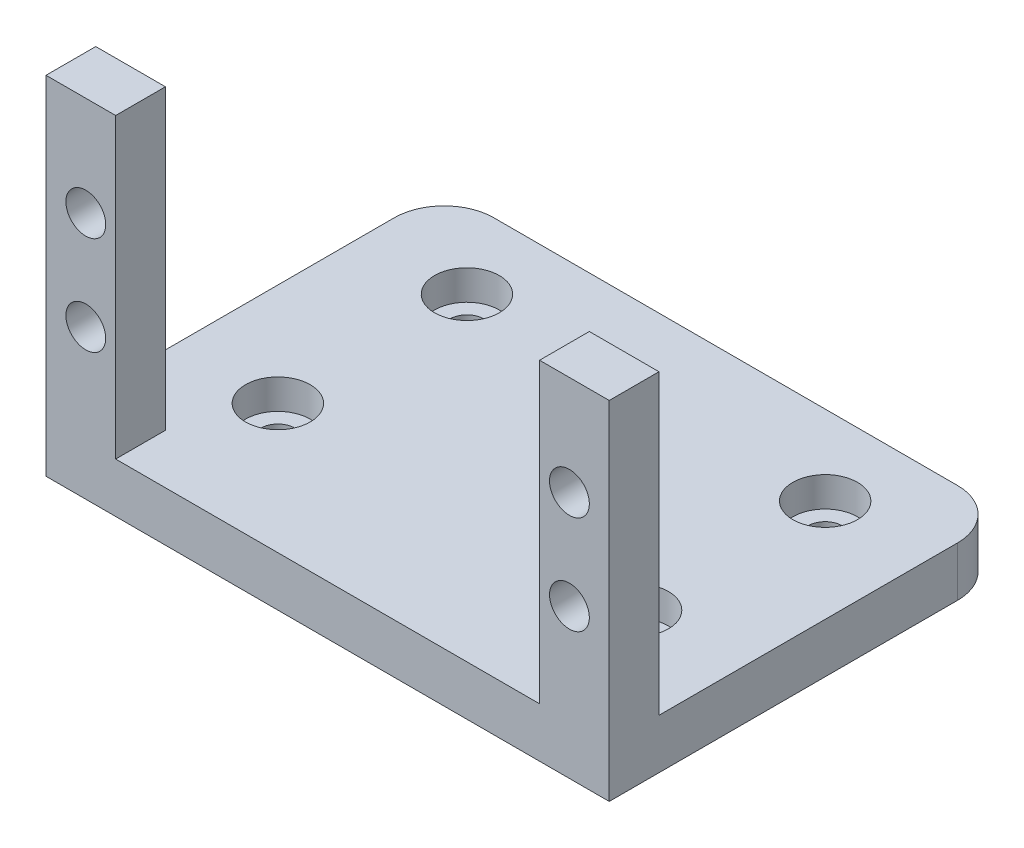
ISO-10303-21;
HEADER;
FILE_DESCRIPTION(('STEP AP214'),'2;1');
FILE_NAME('part.step','',(''),(''),'','','');
FILE_SCHEMA(('AUTOMOTIVE_DESIGN { 1 0 10303 214 1 1 1 1 }'));
ENDSEC;
DATA;
#1=APPLICATION_CONTEXT('core data for automotive mechanical design processes');
#2=APPLICATION_PROTOCOL_DEFINITION('international standard','automotive_design',2000,#1);
#3=PRODUCT_CONTEXT('',#1,'mechanical');
#4=PRODUCT('Part','Part','',(#3));
#5=PRODUCT_RELATED_PRODUCT_CATEGORY('part','',(#4));
#6=PRODUCT_DEFINITION_FORMATION('','',#4);
#7=PRODUCT_DEFINITION_CONTEXT('part definition',#1,'design');
#8=PRODUCT_DEFINITION('design','',#6,#7);
#9=PRODUCT_DEFINITION_SHAPE('','',#8);
#10=(LENGTH_UNIT() NAMED_UNIT(*) SI_UNIT(.MILLI.,.METRE.));
#11=(NAMED_UNIT(*) PLANE_ANGLE_UNIT() SI_UNIT($,.RADIAN.));
#12=(NAMED_UNIT(*) SI_UNIT($,.STERADIAN.) SOLID_ANGLE_UNIT());
#13=UNCERTAINTY_MEASURE_WITH_UNIT(LENGTH_MEASURE(1.E-05),#10,'distance_accuracy_value','');
#14=(GEOMETRIC_REPRESENTATION_CONTEXT(3) GLOBAL_UNCERTAINTY_ASSIGNED_CONTEXT((#13)) GLOBAL_UNIT_ASSIGNED_CONTEXT((#10,
#11,#12)) REPRESENTATION_CONTEXT('',''));
#15=CARTESIAN_POINT('',(0.,0.,0.));
#16=DIRECTION('',(0.,0.,1.));
#17=DIRECTION('',(1.,0.,0.));
#18=AXIS2_PLACEMENT_3D('',#15,#16,#17);
#19=CARTESIAN_POINT('',(0.,-5.,0.));
#20=DIRECTION('',(0.,-1.,0.));
#21=DIRECTION('',(0.,0.,-1.));
#22=AXIS2_PLACEMENT_3D('',#19,#20,#21);
#23=PLANE('',#22);
#24=CARTESIAN_POINT('',(-18.,-5.,-32.));
#25=DIRECTION('',(0.,-1.,0.));
#26=DIRECTION('',(0.,0.,-1.));
#27=AXIS2_PLACEMENT_3D('',#24,#25,#26);
#28=CIRCLE('',#27,1.7);
#29=CARTESIAN_POINT('',(-18.,-5.,-33.7));
#30=VERTEX_POINT('',#29);
#31=EDGE_CURVE('E320',#30,#30,#28,.F.);
#32=ORIENTED_EDGE('',*,*,#31,.T.);
#33=EDGE_LOOP('',(#32));
#34=FACE_BOUND('',#33,.T.);
#35=CARTESIAN_POINT('',(18.,-5.,-13.));
#36=DIRECTION('',(0.,-1.,0.));
#37=DIRECTION('',(0.,0.,-1.));
#38=AXIS2_PLACEMENT_3D('',#35,#36,#37);
#39=CIRCLE('',#38,1.7);
#40=CARTESIAN_POINT('',(18.,-5.,-14.7));
#41=VERTEX_POINT('',#40);
#42=EDGE_CURVE('E308',#41,#41,#39,.F.);
#43=ORIENTED_EDGE('',*,*,#42,.T.);
#44=EDGE_LOOP('',(#43));
#45=FACE_BOUND('',#44,.T.);
#46=CARTESIAN_POINT('',(-18.,-5.,-13.));
#47=DIRECTION('',(0.,-1.,0.));
#48=DIRECTION('',(0.,0.,-1.));
#49=AXIS2_PLACEMENT_3D('',#46,#47,#48);
#50=CIRCLE('',#49,1.7);
#51=CARTESIAN_POINT('',(-18.,-5.,-14.7));
#52=VERTEX_POINT('',#51);
#53=EDGE_CURVE('E296',#52,#52,#50,.F.);
#54=ORIENTED_EDGE('',*,*,#53,.T.);
#55=EDGE_LOOP('',(#54));
#56=FACE_BOUND('',#55,.T.);
#57=DIRECTION('',(-1.,0.,0.));
#58=VECTOR('',#57,1.);
#59=CARTESIAN_POINT('',(-28.3,-5.,-40.));
#60=LINE('',#59,#58);
#61=CARTESIAN_POINT('',(23.3,-5.,-40.));
#62=VERTEX_POINT('',#61);
#63=CARTESIAN_POINT('',(-23.3,-5.,-40.));
#64=VERTEX_POINT('',#63);
#65=EDGE_CURVE('E229',#62,#64,#60,.T.);
#66=ORIENTED_EDGE('',*,*,#65,.F.);
#67=CARTESIAN_POINT('',(23.3,-5.,-35.));
#68=DIRECTION('',(0.,-1.,0.));
#69=DIRECTION('',(0.,0.,-1.));
#70=AXIS2_PLACEMENT_3D('',#67,#68,#69);
#71=CIRCLE('',#70,5.);
#72=CARTESIAN_POINT('',(28.3,-5.,-35.));
#73=VERTEX_POINT('',#72);
#74=EDGE_CURVE('E47',#62,#73,#71,.T.);
#75=ORIENTED_EDGE('',*,*,#74,.T.);
#76=DIRECTION('',(0.,0.,-1.));
#77=VECTOR('',#76,1.);
#78=CARTESIAN_POINT('',(28.3,-5.,0.));
#79=LINE('',#78,#77);
#80=CARTESIAN_POINT('',(28.3,-5.,0.));
#81=VERTEX_POINT('',#80);
#82=EDGE_CURVE('E227',#81,#73,#79,.T.);
#83=ORIENTED_EDGE('',*,*,#82,.F.);
#84=DIRECTION('',(1.,0.,0.));
#85=VECTOR('',#84,1.);
#86=CARTESIAN_POINT('',(-28.3,-5.,0.));
#87=LINE('',#86,#85);
#88=CARTESIAN_POINT('',(-28.3,-5.,0.));
#89=VERTEX_POINT('',#88);
#90=EDGE_CURVE('E138',#89,#81,#87,.T.);
#91=ORIENTED_EDGE('',*,*,#90,.F.);
#92=DIRECTION('',(0.,0.,1.));
#93=VECTOR('',#92,1.);
#94=CARTESIAN_POINT('',(-28.3,-5.,0.));
#95=LINE('',#94,#93);
#96=CARTESIAN_POINT('',(-28.3,-5.,-35.));
#97=VERTEX_POINT('',#96);
#98=EDGE_CURVE('E223',#97,#89,#95,.T.);
#99=ORIENTED_EDGE('',*,*,#98,.F.);
#100=CARTESIAN_POINT('',(-23.3,-5.,-35.));
#101=DIRECTION('',(0.,-1.,0.));
#102=DIRECTION('',(0.,0.,-1.));
#103=AXIS2_PLACEMENT_3D('',#100,#101,#102);
#104=CIRCLE('',#103,5.);
#105=EDGE_CURVE('E59',#97,#64,#104,.T.);
#106=ORIENTED_EDGE('',*,*,#105,.T.);
#107=EDGE_LOOP('',(#66,#75,#83,#91,#99,#106));
#108=FACE_BOUND('',#107,.T.);
#109=CARTESIAN_POINT('',(18.,-5.,-32.));
#110=DIRECTION('',(0.,-1.,0.));
#111=DIRECTION('',(0.,0.,-1.));
#112=AXIS2_PLACEMENT_3D('',#109,#110,#111);
#113=CIRCLE('',#112,1.7);
#114=CARTESIAN_POINT('',(18.,-5.,-33.7));
#115=VERTEX_POINT('',#114);
#116=EDGE_CURVE('E284',#115,#115,#113,.F.);
#117=ORIENTED_EDGE('',*,*,#116,.T.);
#118=EDGE_LOOP('',(#117));
#119=FACE_BOUND('',#118,.T.);
#120=ADVANCED_FACE('F39',(#34,#45,#56,#108,#119),#23,.T.);
#121=CARTESIAN_POINT('',(-28.3,-5.,0.));
#122=DIRECTION('',(-1.,0.,0.));
#123=DIRECTION('',(0.,0.,1.));
#124=AXIS2_PLACEMENT_3D('',#121,#122,#123);
#125=PLANE('',#124);
#126=DIRECTION('',(0.,0.,1.));
#127=VECTOR('',#126,1.);
#128=CARTESIAN_POINT('',(-28.3,0.,0.));
#129=LINE('',#128,#127);
#130=CARTESIAN_POINT('',(-28.3,0.,-35.));
#131=VERTEX_POINT('',#130);
#132=CARTESIAN_POINT('',(-28.3,0.,-5.));
#133=VERTEX_POINT('',#132);
#134=EDGE_CURVE('E217',#131,#133,#129,.T.);
#135=ORIENTED_EDGE('',*,*,#134,.F.);
#136=DIRECTION('',(0.,1.,0.));
#137=VECTOR('',#136,1.);
#138=CARTESIAN_POINT('',(-28.3,-5.,-35.));
#139=LINE('',#138,#137);
#140=EDGE_CURVE('E11',#131,#97,#139,.F.);
#141=ORIENTED_EDGE('',*,*,#140,.T.);
#142=ORIENTED_EDGE('',*,*,#98,.T.);
#143=DIRECTION('',(0.,1.,0.));
#144=VECTOR('',#143,1.);
#145=CARTESIAN_POINT('',(-28.3,-5.,0.));
#146=LINE('',#145,#144);
#147=CARTESIAN_POINT('',(-28.3,29.9,0.));
#148=VERTEX_POINT('',#147);
#149=EDGE_CURVE('E143',#89,#148,#146,.T.);
#150=ORIENTED_EDGE('',*,*,#149,.T.);
#151=DIRECTION('',(0.,0.,1.));
#152=VECTOR('',#151,1.);
#153=CARTESIAN_POINT('',(-28.3,29.9,-5.));
#154=LINE('',#153,#152);
#155=CARTESIAN_POINT('',(-28.3,29.9,-5.));
#156=VERTEX_POINT('',#155);
#157=EDGE_CURVE('E210',#156,#148,#154,.T.);
#158=ORIENTED_EDGE('',*,*,#157,.F.);
#159=DIRECTION('',(0.,-1.,0.));
#160=VECTOR('',#159,1.);
#161=CARTESIAN_POINT('',(-28.3,29.9,-5.));
#162=LINE('',#161,#160);
#163=EDGE_CURVE('E200',#156,#133,#162,.T.);
#164=ORIENTED_EDGE('',*,*,#163,.T.);
#165=EDGE_LOOP('',(#135,#141,#142,#150,#158,#164));
#166=FACE_BOUND('',#165,.T.);
#167=ADVANCED_FACE('F265',(#166),#125,.T.);
#168=CARTESIAN_POINT('',(-28.3,-5.,-40.));
#169=DIRECTION('',(0.,0.,-1.));
#170=DIRECTION('',(-1.,0.,0.));
#171=AXIS2_PLACEMENT_3D('',#168,#169,#170);
#172=PLANE('',#171);
#173=DIRECTION('',(-1.,0.,0.));
#174=VECTOR('',#173,1.);
#175=CARTESIAN_POINT('',(-28.3,0.,-40.));
#176=LINE('',#175,#174);
#177=CARTESIAN_POINT('',(23.3,0.,-40.));
#178=VERTEX_POINT('',#177);
#179=CARTESIAN_POINT('',(-23.3,0.,-40.));
#180=VERTEX_POINT('',#179);
#181=EDGE_CURVE('E225',#178,#180,#176,.T.);
#182=ORIENTED_EDGE('',*,*,#181,.F.);
#183=DIRECTION('',(0.,1.,0.));
#184=VECTOR('',#183,1.);
#185=CARTESIAN_POINT('',(23.3,-5.,-40.));
#186=LINE('',#185,#184);
#187=EDGE_CURVE('E249',#178,#62,#186,.F.);
#188=ORIENTED_EDGE('',*,*,#187,.T.);
#189=ORIENTED_EDGE('',*,*,#65,.T.);
#190=DIRECTION('',(0.,1.,0.));
#191=VECTOR('',#190,1.);
#192=CARTESIAN_POINT('',(-23.3,-5.,-40.));
#193=LINE('',#192,#191);
#194=EDGE_CURVE('E246',#64,#180,#193,.T.);
#195=ORIENTED_EDGE('',*,*,#194,.T.);
#196=EDGE_LOOP('',(#182,#188,#189,#195));
#197=FACE_BOUND('',#196,.T.);
#198=ADVANCED_FACE('F261',(#197),#172,.T.);
#199=CARTESIAN_POINT('',(28.3,-5.,0.));
#200=DIRECTION('',(1.,0.,0.));
#201=DIRECTION('',(0.,0.,-1.));
#202=AXIS2_PLACEMENT_3D('',#199,#200,#201);
#203=PLANE('',#202);
#204=ORIENTED_EDGE('',*,*,#82,.T.);
#205=DIRECTION('',(0.,1.,0.));
#206=VECTOR('',#205,1.);
#207=CARTESIAN_POINT('',(28.3,-5.,-35.));
#208=LINE('',#207,#206);
#209=CARTESIAN_POINT('',(28.3,0.,-35.));
#210=VERTEX_POINT('',#209);
#211=EDGE_CURVE('E142',#73,#210,#208,.T.);
#212=ORIENTED_EDGE('',*,*,#211,.T.);
#213=DIRECTION('',(0.,0.,-1.));
#214=VECTOR('',#213,1.);
#215=CARTESIAN_POINT('',(28.3,0.,0.));
#216=LINE('',#215,#214);
#217=CARTESIAN_POINT('',(28.3,0.,-5.));
#218=VERTEX_POINT('',#217);
#219=EDGE_CURVE('E234',#218,#210,#216,.T.);
#220=ORIENTED_EDGE('',*,*,#219,.F.);
#221=DIRECTION('',(0.,1.,0.));
#222=VECTOR('',#221,1.);
#223=CARTESIAN_POINT('',(28.3,29.9,-5.));
#224=LINE('',#223,#222);
#225=CARTESIAN_POINT('',(28.3,29.9,-5.));
#226=VERTEX_POINT('',#225);
#227=EDGE_CURVE('E150',#218,#226,#224,.T.);
#228=ORIENTED_EDGE('',*,*,#227,.T.);
#229=DIRECTION('',(0.,0.,1.));
#230=VECTOR('',#229,1.);
#231=CARTESIAN_POINT('',(28.3,29.9,-5.));
#232=LINE('',#231,#230);
#233=CARTESIAN_POINT('',(28.3,29.9,0.));
#234=VERTEX_POINT('',#233);
#235=EDGE_CURVE('E146',#226,#234,#232,.T.);
#236=ORIENTED_EDGE('',*,*,#235,.T.);
#237=DIRECTION('',(0.,1.,0.));
#238=VECTOR('',#237,1.);
#239=CARTESIAN_POINT('',(28.3,-5.,0.));
#240=LINE('',#239,#238);
#241=EDGE_CURVE('E128',#81,#234,#240,.T.);
#242=ORIENTED_EDGE('',*,*,#241,.F.);
#243=EDGE_LOOP('',(#204,#212,#220,#228,#236,#242));
#244=FACE_BOUND('',#243,.T.);
#245=ADVANCED_FACE('F147',(#244),#203,.T.);
#246=CARTESIAN_POINT('',(-28.3,-5.,0.));
#247=DIRECTION('',(0.,0.,1.));
#248=DIRECTION('',(1.,0.,0.));
#249=AXIS2_PLACEMENT_3D('',#246,#247,#248);
#250=PLANE('',#249);
#251=DIRECTION('',(1.,0.,0.));
#252=VECTOR('',#251,1.);
#253=CARTESIAN_POINT('',(-28.3,0.,0.));
#254=LINE('',#253,#252);
#255=CARTESIAN_POINT('',(-21.3,0.,0.));
#256=VERTEX_POINT('',#255);
#257=CARTESIAN_POINT('',(21.3,0.,0.));
#258=VERTEX_POINT('',#257);
#259=EDGE_CURVE('E232',#256,#258,#254,.T.);
#260=ORIENTED_EDGE('',*,*,#259,.F.);
#261=DIRECTION('',(0.,1.,0.));
#262=VECTOR('',#261,1.);
#263=CARTESIAN_POINT('',(-21.3,29.9,0.));
#264=LINE('',#263,#262);
#265=CARTESIAN_POINT('',(-21.3,29.9,0.));
#266=VERTEX_POINT('',#265);
#267=EDGE_CURVE('E201',#256,#266,#264,.T.);
#268=ORIENTED_EDGE('',*,*,#267,.T.);
#269=DIRECTION('',(-1.,0.,0.));
#270=VECTOR('',#269,1.);
#271=CARTESIAN_POINT('',(-28.3,29.9,0.));
#272=LINE('',#271,#270);
#273=EDGE_CURVE('E194',#266,#148,#272,.T.);
#274=ORIENTED_EDGE('',*,*,#273,.T.);
#275=ORIENTED_EDGE('',*,*,#149,.F.);
#276=ORIENTED_EDGE('',*,*,#90,.T.);
#277=ORIENTED_EDGE('',*,*,#241,.T.);
#278=DIRECTION('',(-1.,0.,0.));
#279=VECTOR('',#278,1.);
#280=CARTESIAN_POINT('',(28.3,29.9,0.));
#281=LINE('',#280,#279);
#282=CARTESIAN_POINT('',(21.3,29.9,0.));
#283=VERTEX_POINT('',#282);
#284=EDGE_CURVE('E135',#234,#283,#281,.T.);
#285=ORIENTED_EDGE('',*,*,#284,.T.);
#286=DIRECTION('',(0.,-1.,0.));
#287=VECTOR('',#286,1.);
#288=CARTESIAN_POINT('',(21.3,29.9,0.));
#289=LINE('',#288,#287);
#290=EDGE_CURVE('E161',#283,#258,#289,.T.);
#291=ORIENTED_EDGE('',*,*,#290,.T.);
#292=EDGE_LOOP('',(#260,#268,#274,#275,#276,#277,#285,#291));
#293=FACE_BOUND('',#292,.T.);
#294=CARTESIAN_POINT('',(-24.3,10.,0.));
#295=DIRECTION('',(0.,0.,1.));
#296=DIRECTION('',(1.,0.,0.));
#297=AXIS2_PLACEMENT_3D('',#294,#295,#296);
#298=CIRCLE('',#297,2.);
#299=CARTESIAN_POINT('',(-22.3,10.,0.));
#300=VERTEX_POINT('',#299);
#301=EDGE_CURVE('E182',#300,#300,#298,.T.);
#302=ORIENTED_EDGE('',*,*,#301,.F.);
#303=EDGE_LOOP('',(#302));
#304=FACE_BOUND('',#303,.T.);
#305=CARTESIAN_POINT('',(-24.3,19.9,0.));
#306=DIRECTION('',(0.,0.,1.));
#307=DIRECTION('',(1.,0.,0.));
#308=AXIS2_PLACEMENT_3D('',#305,#306,#307);
#309=CIRCLE('',#308,2.);
#310=CARTESIAN_POINT('',(-22.3,19.9,0.));
#311=VERTEX_POINT('',#310);
#312=EDGE_CURVE('E188',#311,#311,#309,.T.);
#313=ORIENTED_EDGE('',*,*,#312,.F.);
#314=EDGE_LOOP('',(#313));
#315=FACE_BOUND('',#314,.T.);
#316=CARTESIAN_POINT('',(24.3,19.9,0.));
#317=DIRECTION('',(0.,0.,1.));
#318=DIRECTION('',(-1.,0.,0.));
#319=AXIS2_PLACEMENT_3D('',#316,#317,#318);
#320=CIRCLE('',#319,2.00000000000001);
#321=CARTESIAN_POINT('',(22.3,19.9,0.));
#322=VERTEX_POINT('',#321);
#323=EDGE_CURVE('E179',#322,#322,#320,.T.);
#324=ORIENTED_EDGE('',*,*,#323,.F.);
#325=EDGE_LOOP('',(#324));
#326=FACE_BOUND('',#325,.T.);
#327=CARTESIAN_POINT('',(24.3,10.,0.));
#328=DIRECTION('',(0.,0.,1.));
#329=DIRECTION('',(-1.,0.,0.));
#330=AXIS2_PLACEMENT_3D('',#327,#328,#329);
#331=CIRCLE('',#330,2.);
#332=CARTESIAN_POINT('',(22.3,10.,0.));
#333=VERTEX_POINT('',#332);
#334=EDGE_CURVE('E164',#333,#333,#331,.T.);
#335=ORIENTED_EDGE('',*,*,#334,.F.);
#336=EDGE_LOOP('',(#335));
#337=FACE_BOUND('',#336,.T.);
#338=ADVANCED_FACE('F131',(#293,#304,#315,#326,#337),#250,.T.);
#339=CARTESIAN_POINT('',(0.,0.,0.));
#340=DIRECTION('',(0.,-1.,0.));
#341=DIRECTION('',(0.,0.,-1.));
#342=AXIS2_PLACEMENT_3D('',#339,#340,#341);
#343=PLANE('',#342);
#344=CARTESIAN_POINT('',(-18.,0.,-32.));
#345=DIRECTION('',(0.,1.,0.));
#346=DIRECTION('',(0.,0.,1.));
#347=AXIS2_PLACEMENT_3D('',#344,#345,#346);
#348=CIRCLE('',#347,3.25);
#349=CARTESIAN_POINT('',(-18.,0.,-28.75));
#350=VERTEX_POINT('',#349);
#351=EDGE_CURVE('E324',#350,#350,#348,.T.);
#352=ORIENTED_EDGE('',*,*,#351,.F.);
#353=EDGE_LOOP('',(#352));
#354=FACE_BOUND('',#353,.T.);
#355=CARTESIAN_POINT('',(18.,0.,-13.));
#356=DIRECTION('',(0.,1.,0.));
#357=DIRECTION('',(0.,0.,1.));
#358=AXIS2_PLACEMENT_3D('',#355,#356,#357);
#359=CIRCLE('',#358,3.25);
#360=CARTESIAN_POINT('',(18.,0.,-9.75));
#361=VERTEX_POINT('',#360);
#362=EDGE_CURVE('E312',#361,#361,#359,.T.);
#363=ORIENTED_EDGE('',*,*,#362,.F.);
#364=EDGE_LOOP('',(#363));
#365=FACE_BOUND('',#364,.T.);
#366=CARTESIAN_POINT('',(-18.,0.,-13.));
#367=DIRECTION('',(0.,1.,0.));
#368=DIRECTION('',(0.,0.,1.));
#369=AXIS2_PLACEMENT_3D('',#366,#367,#368);
#370=CIRCLE('',#369,3.25);
#371=CARTESIAN_POINT('',(-18.,0.,-9.75));
#372=VERTEX_POINT('',#371);
#373=EDGE_CURVE('E300',#372,#372,#370,.T.);
#374=ORIENTED_EDGE('',*,*,#373,.F.);
#375=EDGE_LOOP('',(#374));
#376=FACE_BOUND('',#375,.T.);
#377=CARTESIAN_POINT('',(18.,0.,-32.));
#378=DIRECTION('',(0.,1.,0.));
#379=DIRECTION('',(0.,0.,1.));
#380=AXIS2_PLACEMENT_3D('',#377,#378,#379);
#381=CIRCLE('',#380,3.25);
#382=CARTESIAN_POINT('',(18.,0.,-28.75));
#383=VERTEX_POINT('',#382);
#384=EDGE_CURVE('E288',#383,#383,#381,.T.);
#385=ORIENTED_EDGE('',*,*,#384,.F.);
#386=EDGE_LOOP('',(#385));
#387=FACE_BOUND('',#386,.T.);
#388=ORIENTED_EDGE('',*,*,#219,.T.);
#389=CARTESIAN_POINT('',(23.3,0.,-35.));
#390=DIRECTION('',(0.,-1.,0.));
#391=DIRECTION('',(0.,0.,-1.));
#392=AXIS2_PLACEMENT_3D('',#389,#390,#391);
#393=CIRCLE('',#392,5.);
#394=EDGE_CURVE('E244',#210,#178,#393,.F.);
#395=ORIENTED_EDGE('',*,*,#394,.T.);
#396=ORIENTED_EDGE('',*,*,#181,.T.);
#397=CARTESIAN_POINT('',(-23.3,0.,-35.));
#398=DIRECTION('',(0.,-1.,0.));
#399=DIRECTION('',(0.,0.,-1.));
#400=AXIS2_PLACEMENT_3D('',#397,#398,#399);
#401=CIRCLE('',#400,5.);
#402=EDGE_CURVE('E242',#180,#131,#401,.F.);
#403=ORIENTED_EDGE('',*,*,#402,.T.);
#404=ORIENTED_EDGE('',*,*,#134,.T.);
#405=DIRECTION('',(1.,0.,0.));
#406=VECTOR('',#405,1.);
#407=CARTESIAN_POINT('',(-28.3,0.,-5.));
#408=LINE('',#407,#406);
#409=CARTESIAN_POINT('',(-21.3,0.,-5.));
#410=VERTEX_POINT('',#409);
#411=EDGE_CURVE('E204',#133,#410,#408,.T.);
#412=ORIENTED_EDGE('',*,*,#411,.T.);
#413=DIRECTION('',(0.,0.,1.));
#414=VECTOR('',#413,1.);
#415=CARTESIAN_POINT('',(-21.3,0.,-5.));
#416=LINE('',#415,#414);
#417=EDGE_CURVE('E218',#410,#256,#416,.T.);
#418=ORIENTED_EDGE('',*,*,#417,.T.);
#419=ORIENTED_EDGE('',*,*,#259,.T.);
#420=DIRECTION('',(0.,0.,1.));
#421=VECTOR('',#420,1.);
#422=CARTESIAN_POINT('',(21.3,0.,-5.));
#423=LINE('',#422,#421);
#424=CARTESIAN_POINT('',(21.3,0.,-5.));
#425=VERTEX_POINT('',#424);
#426=EDGE_CURVE('E154',#425,#258,#423,.T.);
#427=ORIENTED_EDGE('',*,*,#426,.F.);
#428=DIRECTION('',(1.,0.,0.));
#429=VECTOR('',#428,1.);
#430=CARTESIAN_POINT('',(28.3,0.,-5.));
#431=LINE('',#430,#429);
#432=EDGE_CURVE('E170',#425,#218,#431,.T.);
#433=ORIENTED_EDGE('',*,*,#432,.T.);
#434=EDGE_LOOP('',(#388,#395,#396,#403,#404,#412,#418,#419,#427,#433));
#435=FACE_BOUND('',#434,.T.);
#436=ADVANCED_FACE('F259',(#354,#365,#376,#387,#435),#343,.F.);
#437=CARTESIAN_POINT('',(-28.3,29.9,-5.));
#438=DIRECTION('',(0.,1.,0.));
#439=DIRECTION('',(-1.,0.,0.));
#440=AXIS2_PLACEMENT_3D('',#437,#438,#439);
#441=PLANE('',#440);
#442=ORIENTED_EDGE('',*,*,#273,.F.);
#443=DIRECTION('',(0.,0.,1.));
#444=VECTOR('',#443,1.);
#445=CARTESIAN_POINT('',(-21.3,29.9,-5.));
#446=LINE('',#445,#444);
#447=CARTESIAN_POINT('',(-21.3,29.9,-5.));
#448=VERTEX_POINT('',#447);
#449=EDGE_CURVE('E215',#448,#266,#446,.T.);
#450=ORIENTED_EDGE('',*,*,#449,.F.);
#451=DIRECTION('',(-1.,0.,0.));
#452=VECTOR('',#451,1.);
#453=CARTESIAN_POINT('',(-28.3,29.9,-5.));
#454=LINE('',#453,#452);
#455=EDGE_CURVE('E197',#448,#156,#454,.T.);
#456=ORIENTED_EDGE('',*,*,#455,.T.);
#457=ORIENTED_EDGE('',*,*,#157,.T.);
#458=EDGE_LOOP('',(#442,#450,#456,#457));
#459=FACE_BOUND('',#458,.T.);
#460=ADVANCED_FACE('F273',(#459),#441,.T.);
#461=CARTESIAN_POINT('',(-21.3,29.9,-5.));
#462=DIRECTION('',(1.,0.,0.));
#463=DIRECTION('',(0.,1.,0.));
#464=AXIS2_PLACEMENT_3D('',#461,#462,#463);
#465=PLANE('',#464);
#466=ORIENTED_EDGE('',*,*,#267,.F.);
#467=ORIENTED_EDGE('',*,*,#417,.F.);
#468=DIRECTION('',(0.,1.,0.));
#469=VECTOR('',#468,1.);
#470=CARTESIAN_POINT('',(-21.3,29.9,-5.));
#471=LINE('',#470,#469);
#472=EDGE_CURVE('E207',#410,#448,#471,.T.);
#473=ORIENTED_EDGE('',*,*,#472,.T.);
#474=ORIENTED_EDGE('',*,*,#449,.T.);
#475=EDGE_LOOP('',(#466,#467,#473,#474));
#476=FACE_BOUND('',#475,.T.);
#477=ADVANCED_FACE('F275',(#476),#465,.T.);
#478=CARTESIAN_POINT('',(0.,0.,-5.));
#479=DIRECTION('',(0.,0.,-1.));
#480=DIRECTION('',(-1.,0.,0.));
#481=AXIS2_PLACEMENT_3D('',#478,#479,#480);
#482=PLANE('',#481);
#483=CARTESIAN_POINT('',(-24.3,10.,-5.));
#484=DIRECTION('',(0.,0.,1.));
#485=DIRECTION('',(1.,0.,0.));
#486=AXIS2_PLACEMENT_3D('',#483,#484,#485);
#487=CIRCLE('',#486,2.);
#488=CARTESIAN_POINT('',(-22.3,10.,-5.));
#489=VERTEX_POINT('',#488);
#490=EDGE_CURVE('E185',#489,#489,#487,.T.);
#491=ORIENTED_EDGE('',*,*,#490,.T.);
#492=EDGE_LOOP('',(#491));
#493=FACE_BOUND('',#492,.T.);
#494=CARTESIAN_POINT('',(-24.3,19.9,-5.));
#495=DIRECTION('',(0.,0.,1.));
#496=DIRECTION('',(1.,0.,0.));
#497=AXIS2_PLACEMENT_3D('',#494,#495,#496);
#498=CIRCLE('',#497,2.);
#499=CARTESIAN_POINT('',(-22.3,19.9,-5.));
#500=VERTEX_POINT('',#499);
#501=EDGE_CURVE('E191',#500,#500,#498,.T.);
#502=ORIENTED_EDGE('',*,*,#501,.T.);
#503=EDGE_LOOP('',(#502));
#504=FACE_BOUND('',#503,.T.);
#505=ORIENTED_EDGE('',*,*,#455,.F.);
#506=ORIENTED_EDGE('',*,*,#472,.F.);
#507=ORIENTED_EDGE('',*,*,#411,.F.);
#508=ORIENTED_EDGE('',*,*,#163,.F.);
#509=EDGE_LOOP('',(#505,#506,#507,#508));
#510=FACE_BOUND('',#509,.T.);
#511=ADVANCED_FACE('F269',(#493,#504,#510),#482,.T.);
#512=CARTESIAN_POINT('',(-24.3,19.9,-5.));
#513=DIRECTION('',(0.,0.,1.));
#514=DIRECTION('',(1.,0.,0.));
#515=AXIS2_PLACEMENT_3D('',#512,#513,#514);
#516=CYLINDRICAL_SURFACE('',#515,2.);
#517=ORIENTED_EDGE('',*,*,#501,.F.);
#518=EDGE_LOOP('',(#517));
#519=FACE_BOUND('',#518,.T.);
#520=ORIENTED_EDGE('',*,*,#312,.T.);
#521=EDGE_LOOP('',(#520));
#522=FACE_BOUND('',#521,.T.);
#523=ADVANCED_FACE('F603',(#519,#522),#516,.F.);
#524=CARTESIAN_POINT('',(-24.3,10.,-5.));
#525=DIRECTION('',(0.,0.,1.));
#526=DIRECTION('',(1.,0.,0.));
#527=AXIS2_PLACEMENT_3D('',#524,#525,#526);
#528=CYLINDRICAL_SURFACE('',#527,2.);
#529=ORIENTED_EDGE('',*,*,#490,.F.);
#530=EDGE_LOOP('',(#529));
#531=FACE_BOUND('',#530,.T.);
#532=ORIENTED_EDGE('',*,*,#301,.T.);
#533=EDGE_LOOP('',(#532));
#534=FACE_BOUND('',#533,.T.);
#535=ADVANCED_FACE('F594',(#531,#534),#528,.F.);
#536=CARTESIAN_POINT('',(28.3,29.9,-5.));
#537=DIRECTION('',(0.,1.,0.));
#538=DIRECTION('',(-1.,0.,0.));
#539=AXIS2_PLACEMENT_3D('',#536,#537,#538);
#540=PLANE('',#539);
#541=ORIENTED_EDGE('',*,*,#284,.F.);
#542=ORIENTED_EDGE('',*,*,#235,.F.);
#543=DIRECTION('',(-1.,0.,0.));
#544=VECTOR('',#543,1.);
#545=CARTESIAN_POINT('',(28.3,29.9,-5.));
#546=LINE('',#545,#544);
#547=CARTESIAN_POINT('',(21.3,29.9,-5.));
#548=VERTEX_POINT('',#547);
#549=EDGE_CURVE('E166',#226,#548,#546,.T.);
#550=ORIENTED_EDGE('',*,*,#549,.T.);
#551=DIRECTION('',(0.,0.,1.));
#552=VECTOR('',#551,1.);
#553=CARTESIAN_POINT('',(21.3,29.9,-5.));
#554=LINE('',#553,#552);
#555=EDGE_CURVE('E158',#548,#283,#554,.T.);
#556=ORIENTED_EDGE('',*,*,#555,.T.);
#557=EDGE_LOOP('',(#541,#542,#550,#556));
#558=FACE_BOUND('',#557,.T.);
#559=ADVANCED_FACE('F157',(#558),#540,.T.);
#560=CARTESIAN_POINT('',(21.3,29.9,-5.));
#561=DIRECTION('',(-1.,0.,0.));
#562=DIRECTION('',(0.,-1.,0.));
#563=AXIS2_PLACEMENT_3D('',#560,#561,#562);
#564=PLANE('',#563);
#565=ORIENTED_EDGE('',*,*,#290,.F.);
#566=ORIENTED_EDGE('',*,*,#555,.F.);
#567=DIRECTION('',(0.,-1.,0.));
#568=VECTOR('',#567,1.);
#569=CARTESIAN_POINT('',(21.3,29.9,-5.));
#570=LINE('',#569,#568);
#571=EDGE_CURVE('E172',#548,#425,#570,.T.);
#572=ORIENTED_EDGE('',*,*,#571,.T.);
#573=ORIENTED_EDGE('',*,*,#426,.T.);
#574=EDGE_LOOP('',(#565,#566,#572,#573));
#575=FACE_BOUND('',#574,.T.);
#576=ADVANCED_FACE('F278',(#575),#564,.T.);
#577=CARTESIAN_POINT('',(0.,0.,-5.));
#578=DIRECTION('',(0.,0.,1.));
#579=DIRECTION('',(1.,0.,0.));
#580=AXIS2_PLACEMENT_3D('',#577,#578,#579);
#581=PLANE('',#580);
#582=CARTESIAN_POINT('',(24.3,19.9,-5.));
#583=DIRECTION('',(0.,0.,1.));
#584=DIRECTION('',(-1.,0.,0.));
#585=AXIS2_PLACEMENT_3D('',#582,#583,#584);
#586=CIRCLE('',#585,2.00000000000001);
#587=CARTESIAN_POINT('',(22.3,19.9,-5.));
#588=VERTEX_POINT('',#587);
#589=EDGE_CURVE('E177',#588,#588,#586,.T.);
#590=ORIENTED_EDGE('',*,*,#589,.T.);
#591=EDGE_LOOP('',(#590));
#592=FACE_BOUND('',#591,.T.);
#593=CARTESIAN_POINT('',(24.3,10.,-5.));
#594=DIRECTION('',(0.,0.,1.));
#595=DIRECTION('',(-1.,0.,0.));
#596=AXIS2_PLACEMENT_3D('',#593,#594,#595);
#597=CIRCLE('',#596,2.);
#598=CARTESIAN_POINT('',(22.3,10.,-5.));
#599=VERTEX_POINT('',#598);
#600=EDGE_CURVE('E160',#599,#599,#597,.T.);
#601=ORIENTED_EDGE('',*,*,#600,.T.);
#602=EDGE_LOOP('',(#601));
#603=FACE_BOUND('',#602,.T.);
#604=ORIENTED_EDGE('',*,*,#549,.F.);
#605=ORIENTED_EDGE('',*,*,#227,.F.);
#606=ORIENTED_EDGE('',*,*,#432,.F.);
#607=ORIENTED_EDGE('',*,*,#571,.F.);
#608=EDGE_LOOP('',(#604,#605,#606,#607));
#609=FACE_BOUND('',#608,.T.);
#610=ADVANCED_FACE('F564',(#592,#603,#609),#581,.F.);
#611=CARTESIAN_POINT('',(24.3,10.,-5.));
#612=DIRECTION('',(0.,0.,1.));
#613=DIRECTION('',(1.,0.,0.));
#614=AXIS2_PLACEMENT_3D('',#611,#612,#613);
#615=CYLINDRICAL_SURFACE('',#614,2.);
#616=ORIENTED_EDGE('',*,*,#600,.F.);
#617=EDGE_LOOP('',(#616));
#618=FACE_BOUND('',#617,.T.);
#619=ORIENTED_EDGE('',*,*,#334,.T.);
#620=EDGE_LOOP('',(#619));
#621=FACE_BOUND('',#620,.T.);
#622=ADVANCED_FACE('F554',(#618,#621),#615,.F.);
#623=CARTESIAN_POINT('',(24.3,19.9,-5.));
#624=DIRECTION('',(0.,0.,1.));
#625=DIRECTION('',(1.,0.,0.));
#626=AXIS2_PLACEMENT_3D('',#623,#624,#625);
#627=CYLINDRICAL_SURFACE('',#626,2.00000000000001);
#628=ORIENTED_EDGE('',*,*,#589,.F.);
#629=EDGE_LOOP('',(#628));
#630=FACE_BOUND('',#629,.T.);
#631=ORIENTED_EDGE('',*,*,#323,.T.);
#632=EDGE_LOOP('',(#631));
#633=FACE_BOUND('',#632,.T.);
#634=ADVANCED_FACE('F544',(#630,#633),#627,.F.);
#635=CARTESIAN_POINT('',(18.,0.,-32.));
#636=DIRECTION('',(0.,1.,0.));
#637=DIRECTION('',(0.,0.,1.));
#638=AXIS2_PLACEMENT_3D('',#635,#636,#637);
#639=CYLINDRICAL_SURFACE('',#638,1.7);
#640=ORIENTED_EDGE('',*,*,#116,.F.);
#641=EDGE_LOOP('',(#640));
#642=FACE_BOUND('',#641,.T.);
#643=CARTESIAN_POINT('',(18.,-3.,-32.));
#644=DIRECTION('',(0.,1.,0.));
#645=DIRECTION('',(0.,0.,1.));
#646=AXIS2_PLACEMENT_3D('',#643,#644,#645);
#647=CIRCLE('',#646,1.7);
#648=CARTESIAN_POINT('',(18.,-3.,-30.3));
#649=VERTEX_POINT('',#648);
#650=EDGE_CURVE('E287',#649,#649,#647,.T.);
#651=ORIENTED_EDGE('',*,*,#650,.T.);
#652=EDGE_LOOP('',(#651));
#653=FACE_BOUND('',#652,.T.);
#654=ADVANCED_FACE('F368',(#642,#653),#639,.F.);
#655=CARTESIAN_POINT('',(19.7,-3.,-32.));
#656=DIRECTION('',(0.,-1.,0.));
#657=DIRECTION('',(0.,0.,-1.));
#658=AXIS2_PLACEMENT_3D('',#655,#656,#657);
#659=PLANE('',#658);
#660=ORIENTED_EDGE('',*,*,#650,.F.);
#661=EDGE_LOOP('',(#660));
#662=FACE_BOUND('',#661,.T.);
#663=CARTESIAN_POINT('',(18.,-3.,-32.));
#664=DIRECTION('',(0.,1.,0.));
#665=DIRECTION('',(0.,0.,1.));
#666=AXIS2_PLACEMENT_3D('',#663,#664,#665);
#667=CIRCLE('',#666,3.25);
#668=CARTESIAN_POINT('',(18.,-3.,-28.75));
#669=VERTEX_POINT('',#668);
#670=EDGE_CURVE('E155',#669,#669,#667,.T.);
#671=ORIENTED_EDGE('',*,*,#670,.T.);
#672=EDGE_LOOP('',(#671));
#673=FACE_BOUND('',#672,.T.);
#674=ADVANCED_FACE('F358',(#662,#673),#659,.F.);
#675=CARTESIAN_POINT('',(18.,0.,-32.));
#676=DIRECTION('',(0.,1.,0.));
#677=DIRECTION('',(0.,0.,1.));
#678=AXIS2_PLACEMENT_3D('',#675,#676,#677);
#679=CYLINDRICAL_SURFACE('',#678,3.25);
#680=ORIENTED_EDGE('',*,*,#670,.F.);
#681=EDGE_LOOP('',(#680));
#682=FACE_BOUND('',#681,.T.);
#683=ORIENTED_EDGE('',*,*,#384,.T.);
#684=EDGE_LOOP('',(#683));
#685=FACE_BOUND('',#684,.T.);
#686=ADVANCED_FACE('F355',(#682,#685),#679,.F.);
#687=CARTESIAN_POINT('',(-18.,0.,-13.));
#688=DIRECTION('',(0.,1.,0.));
#689=DIRECTION('',(0.,0.,1.));
#690=AXIS2_PLACEMENT_3D('',#687,#688,#689);
#691=CYLINDRICAL_SURFACE('',#690,1.7);
#692=ORIENTED_EDGE('',*,*,#53,.F.);
#693=EDGE_LOOP('',(#692));
#694=FACE_BOUND('',#693,.T.);
#695=CARTESIAN_POINT('',(-18.,-3.,-13.));
#696=DIRECTION('',(0.,1.,0.));
#697=DIRECTION('',(0.,0.,1.));
#698=AXIS2_PLACEMENT_3D('',#695,#696,#697);
#699=CIRCLE('',#698,1.7);
#700=CARTESIAN_POINT('',(-18.,-3.,-11.3));
#701=VERTEX_POINT('',#700);
#702=EDGE_CURVE('E299',#701,#701,#699,.T.);
#703=ORIENTED_EDGE('',*,*,#702,.T.);
#704=EDGE_LOOP('',(#703));
#705=FACE_BOUND('',#704,.T.);
#706=ADVANCED_FACE('F357',(#694,#705),#691,.F.);
#707=CARTESIAN_POINT('',(-16.3,-3.,-13.));
#708=DIRECTION('',(0.,-1.,0.));
#709=DIRECTION('',(0.,0.,-1.));
#710=AXIS2_PLACEMENT_3D('',#707,#708,#709);
#711=PLANE('',#710);
#712=ORIENTED_EDGE('',*,*,#702,.F.);
#713=EDGE_LOOP('',(#712));
#714=FACE_BOUND('',#713,.T.);
#715=CARTESIAN_POINT('',(-18.,-3.,-13.));
#716=DIRECTION('',(0.,1.,0.));
#717=DIRECTION('',(0.,0.,1.));
#718=AXIS2_PLACEMENT_3D('',#715,#716,#717);
#719=CIRCLE('',#718,3.25);
#720=CARTESIAN_POINT('',(-18.,-3.,-9.75));
#721=VERTEX_POINT('',#720);
#722=EDGE_CURVE('E291',#721,#721,#719,.T.);
#723=ORIENTED_EDGE('',*,*,#722,.T.);
#724=EDGE_LOOP('',(#723));
#725=FACE_BOUND('',#724,.T.);
#726=ADVANCED_FACE('F365',(#714,#725),#711,.F.);
#727=CARTESIAN_POINT('',(-18.,0.,-13.));
#728=DIRECTION('',(0.,1.,0.));
#729=DIRECTION('',(0.,0.,1.));
#730=AXIS2_PLACEMENT_3D('',#727,#728,#729);
#731=CYLINDRICAL_SURFACE('',#730,3.25);
#732=ORIENTED_EDGE('',*,*,#722,.F.);
#733=EDGE_LOOP('',(#732));
#734=FACE_BOUND('',#733,.T.);
#735=ORIENTED_EDGE('',*,*,#373,.T.);
#736=EDGE_LOOP('',(#735));
#737=FACE_BOUND('',#736,.T.);
#738=ADVANCED_FACE('F494',(#734,#737),#731,.F.);
#739=CARTESIAN_POINT('',(18.,0.,-13.));
#740=DIRECTION('',(0.,1.,0.));
#741=DIRECTION('',(0.,0.,1.));
#742=AXIS2_PLACEMENT_3D('',#739,#740,#741);
#743=CYLINDRICAL_SURFACE('',#742,1.7);
#744=ORIENTED_EDGE('',*,*,#42,.F.);
#745=EDGE_LOOP('',(#744));
#746=FACE_BOUND('',#745,.T.);
#747=CARTESIAN_POINT('',(18.,-3.,-13.));
#748=DIRECTION('',(0.,1.,0.));
#749=DIRECTION('',(0.,0.,1.));
#750=AXIS2_PLACEMENT_3D('',#747,#748,#749);
#751=CIRCLE('',#750,1.7);
#752=CARTESIAN_POINT('',(18.,-3.,-11.3));
#753=VERTEX_POINT('',#752);
#754=EDGE_CURVE('E311',#753,#753,#751,.T.);
#755=ORIENTED_EDGE('',*,*,#754,.T.);
#756=EDGE_LOOP('',(#755));
#757=FACE_BOUND('',#756,.T.);
#758=ADVANCED_FACE('F483',(#746,#757),#743,.F.);
#759=CARTESIAN_POINT('',(19.7,-3.,-13.));
#760=DIRECTION('',(0.,-1.,0.));
#761=DIRECTION('',(0.,0.,-1.));
#762=AXIS2_PLACEMENT_3D('',#759,#760,#761);
#763=PLANE('',#762);
#764=ORIENTED_EDGE('',*,*,#754,.F.);
#765=EDGE_LOOP('',(#764));
#766=FACE_BOUND('',#765,.T.);
#767=CARTESIAN_POINT('',(18.,-3.,-13.));
#768=DIRECTION('',(0.,1.,0.));
#769=DIRECTION('',(0.,0.,1.));
#770=AXIS2_PLACEMENT_3D('',#767,#768,#769);
#771=CIRCLE('',#770,3.25);
#772=CARTESIAN_POINT('',(18.,-3.,-9.75));
#773=VERTEX_POINT('',#772);
#774=EDGE_CURVE('E303',#773,#773,#771,.T.);
#775=ORIENTED_EDGE('',*,*,#774,.T.);
#776=EDGE_LOOP('',(#775));
#777=FACE_BOUND('',#776,.T.);
#778=ADVANCED_FACE('F472',(#766,#777),#763,.F.);
#779=CARTESIAN_POINT('',(18.,0.,-13.));
#780=DIRECTION('',(0.,1.,0.));
#781=DIRECTION('',(0.,0.,1.));
#782=AXIS2_PLACEMENT_3D('',#779,#780,#781);
#783=CYLINDRICAL_SURFACE('',#782,3.25);
#784=ORIENTED_EDGE('',*,*,#774,.F.);
#785=EDGE_LOOP('',(#784));
#786=FACE_BOUND('',#785,.T.);
#787=ORIENTED_EDGE('',*,*,#362,.T.);
#788=EDGE_LOOP('',(#787));
#789=FACE_BOUND('',#788,.T.);
#790=ADVANCED_FACE('F461',(#786,#789),#783,.F.);
#791=CARTESIAN_POINT('',(-18.,0.,-32.));
#792=DIRECTION('',(0.,1.,0.));
#793=DIRECTION('',(0.,0.,1.));
#794=AXIS2_PLACEMENT_3D('',#791,#792,#793);
#795=CYLINDRICAL_SURFACE('',#794,1.7);
#796=ORIENTED_EDGE('',*,*,#31,.F.);
#797=EDGE_LOOP('',(#796));
#798=FACE_BOUND('',#797,.T.);
#799=CARTESIAN_POINT('',(-18.,-3.,-32.));
#800=DIRECTION('',(0.,1.,0.));
#801=DIRECTION('',(0.,0.,1.));
#802=AXIS2_PLACEMENT_3D('',#799,#800,#801);
#803=CIRCLE('',#802,1.7);
#804=CARTESIAN_POINT('',(-18.,-3.,-30.3));
#805=VERTEX_POINT('',#804);
#806=EDGE_CURVE('E323',#805,#805,#803,.T.);
#807=ORIENTED_EDGE('',*,*,#806,.T.);
#808=EDGE_LOOP('',(#807));
#809=FACE_BOUND('',#808,.T.);
#810=ADVANCED_FACE('F332',(#798,#809),#795,.F.);
#811=CARTESIAN_POINT('',(-16.3,-3.,-32.));
#812=DIRECTION('',(0.,-1.,0.));
#813=DIRECTION('',(0.,0.,-1.));
#814=AXIS2_PLACEMENT_3D('',#811,#812,#813);
#815=PLANE('',#814);
#816=ORIENTED_EDGE('',*,*,#806,.F.);
#817=EDGE_LOOP('',(#816));
#818=FACE_BOUND('',#817,.T.);
#819=CARTESIAN_POINT('',(-18.,-3.,-32.));
#820=DIRECTION('',(0.,1.,0.));
#821=DIRECTION('',(0.,0.,1.));
#822=AXIS2_PLACEMENT_3D('',#819,#820,#821);
#823=CIRCLE('',#822,3.25);
#824=CARTESIAN_POINT('',(-18.,-3.,-28.75));
#825=VERTEX_POINT('',#824);
#826=EDGE_CURVE('E315',#825,#825,#823,.T.);
#827=ORIENTED_EDGE('',*,*,#826,.T.);
#828=EDGE_LOOP('',(#827));
#829=FACE_BOUND('',#828,.T.);
#830=ADVANCED_FACE('F334',(#818,#829),#815,.F.);
#831=CARTESIAN_POINT('',(-18.,0.,-32.));
#832=DIRECTION('',(0.,1.,0.));
#833=DIRECTION('',(0.,0.,1.));
#834=AXIS2_PLACEMENT_3D('',#831,#832,#833);
#835=CYLINDRICAL_SURFACE('',#834,3.25);
#836=ORIENTED_EDGE('',*,*,#826,.F.);
#837=EDGE_LOOP('',(#836));
#838=FACE_BOUND('',#837,.T.);
#839=ORIENTED_EDGE('',*,*,#351,.T.);
#840=EDGE_LOOP('',(#839));
#841=FACE_BOUND('',#840,.T.);
#842=ADVANCED_FACE('F337',(#838,#841),#835,.F.);
#843=CARTESIAN_POINT('',(23.3,-5.,-35.));
#844=DIRECTION('',(0.,1.,0.));
#845=DIRECTION('',(0.,0.,1.));
#846=AXIS2_PLACEMENT_3D('',#843,#844,#845);
#847=CYLINDRICAL_SURFACE('',#846,5.);
#848=ORIENTED_EDGE('',*,*,#74,.F.);
#849=ORIENTED_EDGE('',*,*,#187,.F.);
#850=ORIENTED_EDGE('',*,*,#394,.F.);
#851=ORIENTED_EDGE('',*,*,#211,.F.);
#852=EDGE_LOOP('',(#848,#849,#850,#851));
#853=FACE_BOUND('',#852,.T.);
#854=ADVANCED_FACE('F256',(#853),#847,.T.);
#855=CARTESIAN_POINT('',(-23.3,-5.,-35.));
#856=DIRECTION('',(0.,1.,0.));
#857=DIRECTION('',(0.,0.,1.));
#858=AXIS2_PLACEMENT_3D('',#855,#856,#857);
#859=CYLINDRICAL_SURFACE('',#858,5.);
#860=ORIENTED_EDGE('',*,*,#105,.F.);
#861=ORIENTED_EDGE('',*,*,#140,.F.);
#862=ORIENTED_EDGE('',*,*,#402,.F.);
#863=ORIENTED_EDGE('',*,*,#194,.F.);
#864=EDGE_LOOP('',(#860,#861,#862,#863));
#865=FACE_BOUND('',#864,.T.);
#866=ADVANCED_FACE('F41',(#865),#859,.T.);
#867=CLOSED_SHELL('',(#120,#167,#198,#245,#338,#436,#460,#477,#511,#523,#535,#559,#576,#610,
#622,#634,#654,#674,#686,#706,#726,#738,#758,#778,#790,#810,#830,#842,#854,#866));
#868=MANIFOLD_SOLID_BREP('B2',#867);
#869=ADVANCED_BREP_SHAPE_REPRESENTATION('',(#18,#868),#14);
#870=SHAPE_DEFINITION_REPRESENTATION(#9,#869);
ENDSEC;
END-ISO-10303-21;
